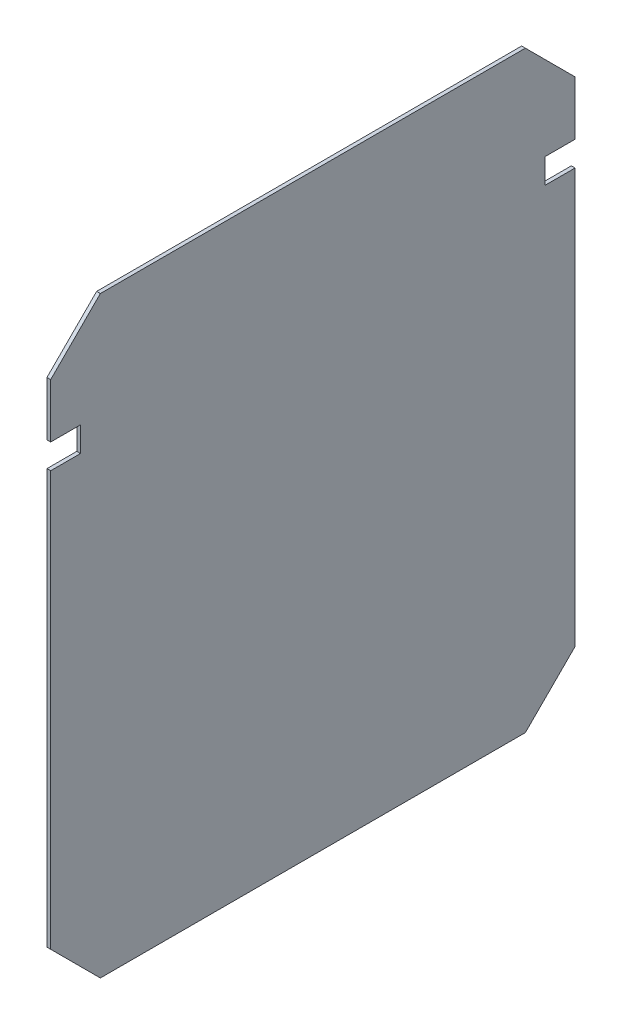
ISO-10303-21;
HEADER;
FILE_DESCRIPTION(('STEP AP214'),'2;1');
FILE_NAME('part.step','',(''),(''),'','','');
FILE_SCHEMA(('AUTOMOTIVE_DESIGN { 1 0 10303 214 1 1 1 1 }'));
ENDSEC;
DATA;
#1=APPLICATION_CONTEXT('core data for automotive mechanical design processes');
#2=APPLICATION_PROTOCOL_DEFINITION('international standard','automotive_design',2000,#1);
#3=PRODUCT_CONTEXT('',#1,'mechanical');
#4=PRODUCT('Part','Part','',(#3));
#5=PRODUCT_RELATED_PRODUCT_CATEGORY('part','',(#4));
#6=PRODUCT_DEFINITION_FORMATION('','',#4);
#7=PRODUCT_DEFINITION_CONTEXT('part definition',#1,'design');
#8=PRODUCT_DEFINITION('design','',#6,#7);
#9=PRODUCT_DEFINITION_SHAPE('','',#8);
#10=(LENGTH_UNIT() NAMED_UNIT(*) SI_UNIT(.MILLI.,.METRE.));
#11=(NAMED_UNIT(*) PLANE_ANGLE_UNIT() SI_UNIT($,.RADIAN.));
#12=(NAMED_UNIT(*) SI_UNIT($,.STERADIAN.) SOLID_ANGLE_UNIT());
#13=UNCERTAINTY_MEASURE_WITH_UNIT(LENGTH_MEASURE(1.E-05),#10,'distance_accuracy_value','');
#14=(GEOMETRIC_REPRESENTATION_CONTEXT(3) GLOBAL_UNCERTAINTY_ASSIGNED_CONTEXT((#13)) GLOBAL_UNIT_ASSIGNED_CONTEXT((#10,
#11,#12)) REPRESENTATION_CONTEXT('',''));
#15=CARTESIAN_POINT('',(0.,0.,0.));
#16=DIRECTION('',(0.,0.,1.));
#17=DIRECTION('',(1.,0.,0.));
#18=AXIS2_PLACEMENT_3D('',#15,#16,#17);
#19=CARTESIAN_POINT('',(1.5,-238.5,211.));
#20=DIRECTION('',(0.,0.,-1.));
#21=DIRECTION('',(0.,1.,0.));
#22=AXIS2_PLACEMENT_3D('',#19,#20,#21);
#23=PLANE('',#22);
#24=DIRECTION('',(-1.,0.,0.));
#25=VECTOR('',#24,1.);
#26=CARTESIAN_POINT('',(1.5,135.,211.));
#27=LINE('',#26,#25);
#28=CARTESIAN_POINT('',(1.5,135.,211.));
#29=VERTEX_POINT('',#28);
#30=CARTESIAN_POINT('',(-1.5,135.,211.));
#31=VERTEX_POINT('',#30);
#32=EDGE_CURVE('E135',#29,#31,#27,.T.);
#33=ORIENTED_EDGE('',*,*,#32,.T.);
#34=DIRECTION('',(0.,-1.,0.));
#35=VECTOR('',#34,1.);
#36=CARTESIAN_POINT('',(-1.5,-238.5,211.));
#37=LINE('',#36,#35);
#38=CARTESIAN_POINT('',(-1.5,-198.5,211.));
#39=VERTEX_POINT('',#38);
#40=EDGE_CURVE('E149',#31,#39,#37,.T.);
#41=ORIENTED_EDGE('',*,*,#40,.T.);
#42=DIRECTION('',(1.,0.,0.));
#43=VECTOR('',#42,1.);
#44=CARTESIAN_POINT('',(1.5,-198.5,211.));
#45=LINE('',#44,#43);
#46=CARTESIAN_POINT('',(1.5,-198.5,211.));
#47=VERTEX_POINT('',#46);
#48=EDGE_CURVE('E204',#39,#47,#45,.T.);
#49=ORIENTED_EDGE('',*,*,#48,.T.);
#50=DIRECTION('',(0.,-1.,0.));
#51=VECTOR('',#50,1.);
#52=CARTESIAN_POINT('',(1.5,-238.5,211.));
#53=LINE('',#52,#51);
#54=EDGE_CURVE('E151',#29,#47,#53,.T.);
#55=ORIENTED_EDGE('',*,*,#54,.F.);
#56=EDGE_LOOP('',(#33,#41,#49,#55));
#57=FACE_BOUND('',#56,.T.);
#58=ADVANCED_FACE('F17',(#57),#23,.F.);
#59=DIRECTION('',(-1.,0.,0.));
#60=VECTOR('',#59,1.);
#61=CARTESIAN_POINT('',(1.5,155.,211.));
#62=LINE('',#61,#60);
#63=CARTESIAN_POINT('',(1.5,155.,211.));
#64=VERTEX_POINT('',#63);
#65=CARTESIAN_POINT('',(-1.5,155.,211.));
#66=VERTEX_POINT('',#65);
#67=EDGE_CURVE('E33',#64,#66,#62,.T.);
#68=ORIENTED_EDGE('',*,*,#67,.F.);
#69=CARTESIAN_POINT('',(1.5,198.5,211.));
#70=VERTEX_POINT('',#69);
#71=EDGE_CURVE('E225',#70,#64,#53,.T.);
#72=ORIENTED_EDGE('',*,*,#71,.F.);
#73=DIRECTION('',(-1.,0.,0.));
#74=VECTOR('',#73,1.);
#75=CARTESIAN_POINT('',(1.5,198.5,211.));
#76=LINE('',#75,#74);
#77=CARTESIAN_POINT('',(-1.5,198.5,211.));
#78=VERTEX_POINT('',#77);
#79=EDGE_CURVE('E201',#70,#78,#76,.T.);
#80=ORIENTED_EDGE('',*,*,#79,.T.);
#81=EDGE_CURVE('E157',#78,#66,#37,.T.);
#82=ORIENTED_EDGE('',*,*,#81,.T.);
#83=EDGE_LOOP('',(#68,#72,#80,#82));
#84=FACE_BOUND('',#83,.T.);
#85=ADVANCED_FACE('F224',(#84),#23,.F.);
#86=CARTESIAN_POINT('',(1.5,-238.5,-211.));
#87=DIRECTION('',(0.,0.,1.));
#88=DIRECTION('',(1.,0.,0.));
#89=AXIS2_PLACEMENT_3D('',#86,#87,#88);
#90=PLANE('',#89);
#91=DIRECTION('',(-1.,0.,0.));
#92=VECTOR('',#91,1.);
#93=CARTESIAN_POINT('',(1.5,155.,-211.));
#94=LINE('',#93,#92);
#95=CARTESIAN_POINT('',(1.5,155.,-211.));
#96=VERTEX_POINT('',#95);
#97=CARTESIAN_POINT('',(-1.5,155.,-211.));
#98=VERTEX_POINT('',#97);
#99=EDGE_CURVE('E255',#96,#98,#94,.T.);
#100=ORIENTED_EDGE('',*,*,#99,.T.);
#101=DIRECTION('',(0.,1.,0.));
#102=VECTOR('',#101,1.);
#103=CARTESIAN_POINT('',(-1.5,-238.5,-211.));
#104=LINE('',#103,#102);
#105=CARTESIAN_POINT('',(-1.5,198.5,-211.));
#106=VERTEX_POINT('',#105);
#107=EDGE_CURVE('E167',#98,#106,#104,.T.);
#108=ORIENTED_EDGE('',*,*,#107,.T.);
#109=DIRECTION('',(1.,0.,0.));
#110=VECTOR('',#109,1.);
#111=CARTESIAN_POINT('',(1.5,198.5,-211.));
#112=LINE('',#111,#110);
#113=CARTESIAN_POINT('',(1.5,198.5,-211.));
#114=VERTEX_POINT('',#113);
#115=EDGE_CURVE('E174',#106,#114,#112,.T.);
#116=ORIENTED_EDGE('',*,*,#115,.T.);
#117=DIRECTION('',(0.,1.,0.));
#118=VECTOR('',#117,1.);
#119=CARTESIAN_POINT('',(1.5,-238.5,-211.));
#120=LINE('',#119,#118);
#121=EDGE_CURVE('E265',#96,#114,#120,.T.);
#122=ORIENTED_EDGE('',*,*,#121,.F.);
#123=EDGE_LOOP('',(#100,#108,#116,#122));
#124=FACE_BOUND('',#123,.T.);
#125=ADVANCED_FACE('F274',(#124),#90,.F.);
#126=DIRECTION('',(-1.,0.,0.));
#127=VECTOR('',#126,1.);
#128=CARTESIAN_POINT('',(1.5,135.,-211.));
#129=LINE('',#128,#127);
#130=CARTESIAN_POINT('',(1.5,135.,-211.));
#131=VERTEX_POINT('',#130);
#132=CARTESIAN_POINT('',(-1.5,135.,-211.));
#133=VERTEX_POINT('',#132);
#134=EDGE_CURVE('E41',#131,#133,#129,.T.);
#135=ORIENTED_EDGE('',*,*,#134,.F.);
#136=CARTESIAN_POINT('',(1.5,-198.5,-211.));
#137=VERTEX_POINT('',#136);
#138=EDGE_CURVE('E220',#137,#131,#120,.T.);
#139=ORIENTED_EDGE('',*,*,#138,.F.);
#140=DIRECTION('',(-1.,0.,0.));
#141=VECTOR('',#140,1.);
#142=CARTESIAN_POINT('',(1.5,-198.5,-211.));
#143=LINE('',#142,#141);
#144=CARTESIAN_POINT('',(-1.5,-198.5,-211.));
#145=VERTEX_POINT('',#144);
#146=EDGE_CURVE('E177',#137,#145,#143,.T.);
#147=ORIENTED_EDGE('',*,*,#146,.T.);
#148=EDGE_CURVE('E168',#145,#133,#104,.T.);
#149=ORIENTED_EDGE('',*,*,#148,.T.);
#150=EDGE_LOOP('',(#135,#139,#147,#149));
#151=FACE_BOUND('',#150,.T.);
#152=ADVANCED_FACE('F288',(#151),#90,.F.);
#153=CARTESIAN_POINT('',(1.5,0.,0.));
#154=DIRECTION('',(1.,0.,0.));
#155=DIRECTION('',(0.,0.,-1.));
#156=AXIS2_PLACEMENT_3D('',#153,#154,#155);
#157=PLANE('',#156);
#158=DIRECTION('',(0.,1.,0.));
#159=VECTOR('',#158,1.);
#160=CARTESIAN_POINT('',(1.5,155.,187.));
#161=LINE('',#160,#159);
#162=CARTESIAN_POINT('',(1.5,135.,187.));
#163=VERTEX_POINT('',#162);
#164=CARTESIAN_POINT('',(1.5,155.,187.));
#165=VERTEX_POINT('',#164);
#166=EDGE_CURVE('E230',#163,#165,#161,.T.);
#167=ORIENTED_EDGE('',*,*,#166,.F.);
#168=DIRECTION('',(0.,0.,-1.));
#169=VECTOR('',#168,1.);
#170=CARTESIAN_POINT('',(1.5,135.,211.));
#171=LINE('',#170,#169);
#172=EDGE_CURVE('E228',#29,#163,#171,.T.);
#173=ORIENTED_EDGE('',*,*,#172,.F.);
#174=ORIENTED_EDGE('',*,*,#54,.T.);
#175=DIRECTION('',(0.,0.707106781186548,0.707106781186547));
#176=VECTOR('',#175,1.);
#177=CARTESIAN_POINT('',(1.5,-204.75,204.75));
#178=LINE('',#177,#176);
#179=CARTESIAN_POINT('',(1.5,-238.5,171.));
#180=VERTEX_POINT('',#179);
#181=EDGE_CURVE('E197',#47,#180,#178,.F.);
#182=ORIENTED_EDGE('',*,*,#181,.T.);
#183=DIRECTION('',(0.,0.,-1.));
#184=VECTOR('',#183,1.);
#185=CARTESIAN_POINT('',(1.5,-238.5,-211.));
#186=LINE('',#185,#184);
#187=CARTESIAN_POINT('',(1.5,-238.5,-171.));
#188=VERTEX_POINT('',#187);
#189=EDGE_CURVE('E263',#180,#188,#186,.T.);
#190=ORIENTED_EDGE('',*,*,#189,.T.);
#191=DIRECTION('',(0.,-0.707106781186546,0.707106781186549));
#192=VECTOR('',#191,1.);
#193=CARTESIAN_POINT('',(1.5,-204.75,-204.75));
#194=LINE('',#193,#192);
#195=EDGE_CURVE('E199',#188,#137,#194,.F.);
#196=ORIENTED_EDGE('',*,*,#195,.T.);
#197=ORIENTED_EDGE('',*,*,#138,.T.);
#198=DIRECTION('',(0.,0.,-1.));
#199=VECTOR('',#198,1.);
#200=CARTESIAN_POINT('',(1.5,135.,-211.));
#201=LINE('',#200,#199);
#202=CARTESIAN_POINT('',(1.5,135.,-187.));
#203=VERTEX_POINT('',#202);
#204=EDGE_CURVE('E253',#203,#131,#201,.T.);
#205=ORIENTED_EDGE('',*,*,#204,.F.);
#206=DIRECTION('',(0.,-1.,0.));
#207=VECTOR('',#206,1.);
#208=CARTESIAN_POINT('',(1.5,155.,-187.));
#209=LINE('',#208,#207);
#210=CARTESIAN_POINT('',(1.5,155.,-187.));
#211=VERTEX_POINT('',#210);
#212=EDGE_CURVE('E251',#211,#203,#209,.T.);
#213=ORIENTED_EDGE('',*,*,#212,.F.);
#214=DIRECTION('',(0.,0.,1.));
#215=VECTOR('',#214,1.);
#216=CARTESIAN_POINT('',(1.5,155.,-211.));
#217=LINE('',#216,#215);
#218=EDGE_CURVE('E249',#96,#211,#217,.T.);
#219=ORIENTED_EDGE('',*,*,#218,.F.);
#220=ORIENTED_EDGE('',*,*,#121,.T.);
#221=DIRECTION('',(0.,-0.707106781186549,-0.707106781186546));
#222=VECTOR('',#221,1.);
#223=CARTESIAN_POINT('',(1.5,204.75,-204.75));
#224=LINE('',#223,#222);
#225=CARTESIAN_POINT('',(1.5,238.5,-171.));
#226=VERTEX_POINT('',#225);
#227=EDGE_CURVE('E195',#114,#226,#224,.F.);
#228=ORIENTED_EDGE('',*,*,#227,.T.);
#229=DIRECTION('',(0.,0.,1.));
#230=VECTOR('',#229,1.);
#231=CARTESIAN_POINT('',(1.5,238.5,-211.));
#232=LINE('',#231,#230);
#233=CARTESIAN_POINT('',(1.5,238.5,171.));
#234=VERTEX_POINT('',#233);
#235=EDGE_CURVE('E163',#226,#234,#232,.T.);
#236=ORIENTED_EDGE('',*,*,#235,.T.);
#237=DIRECTION('',(0.,0.707106781186546,-0.70710678118655));
#238=VECTOR('',#237,1.);
#239=CARTESIAN_POINT('',(1.5,204.75,204.75));
#240=LINE('',#239,#238);
#241=EDGE_CURVE('E193',#234,#70,#240,.F.);
#242=ORIENTED_EDGE('',*,*,#241,.T.);
#243=ORIENTED_EDGE('',*,*,#71,.T.);
#244=DIRECTION('',(0.,0.,1.));
#245=VECTOR('',#244,1.);
#246=CARTESIAN_POINT('',(1.5,155.,211.));
#247=LINE('',#246,#245);
#248=EDGE_CURVE('E235',#165,#64,#247,.T.);
#249=ORIENTED_EDGE('',*,*,#248,.F.);
#250=EDGE_LOOP('',(#167,#173,#174,#182,#190,#196,#197,#205,#213,#219,#220,#228,#236,#242,#243,#249));
#251=FACE_BOUND('',#250,.T.);
#252=ADVANCED_FACE('F216',(#251),#157,.T.);
#253=CARTESIAN_POINT('',(-1.5,0.,0.));
#254=DIRECTION('',(1.,0.,0.));
#255=DIRECTION('',(0.,0.,-1.));
#256=AXIS2_PLACEMENT_3D('',#253,#254,#255);
#257=PLANE('',#256);
#258=DIRECTION('',(0.,0.,-1.));
#259=VECTOR('',#258,1.);
#260=CARTESIAN_POINT('',(-1.5,135.,211.));
#261=LINE('',#260,#259);
#262=CARTESIAN_POINT('',(-1.5,135.,187.));
#263=VERTEX_POINT('',#262);
#264=EDGE_CURVE('E132',#31,#263,#261,.T.);
#265=ORIENTED_EDGE('',*,*,#264,.T.);
#266=DIRECTION('',(0.,1.,0.));
#267=VECTOR('',#266,1.);
#268=CARTESIAN_POINT('',(-1.5,155.,187.));
#269=LINE('',#268,#267);
#270=CARTESIAN_POINT('',(-1.5,155.,187.));
#271=VERTEX_POINT('',#270);
#272=EDGE_CURVE('E143',#263,#271,#269,.T.);
#273=ORIENTED_EDGE('',*,*,#272,.T.);
#274=DIRECTION('',(0.,0.,1.));
#275=VECTOR('',#274,1.);
#276=CARTESIAN_POINT('',(-1.5,155.,211.));
#277=LINE('',#276,#275);
#278=EDGE_CURVE('E226',#271,#66,#277,.T.);
#279=ORIENTED_EDGE('',*,*,#278,.T.);
#280=ORIENTED_EDGE('',*,*,#81,.F.);
#281=DIRECTION('',(0.,-0.707106781186546,0.70710678118655));
#282=VECTOR('',#281,1.);
#283=CARTESIAN_POINT('',(-1.5,198.5,211.));
#284=LINE('',#283,#282);
#285=CARTESIAN_POINT('',(-1.5,238.5,171.));
#286=VERTEX_POINT('',#285);
#287=EDGE_CURVE('E180',#78,#286,#284,.F.);
#288=ORIENTED_EDGE('',*,*,#287,.T.);
#289=DIRECTION('',(0.,0.,1.));
#290=VECTOR('',#289,1.);
#291=CARTESIAN_POINT('',(-1.5,238.5,-211.));
#292=LINE('',#291,#290);
#293=CARTESIAN_POINT('',(-1.5,238.5,-171.));
#294=VERTEX_POINT('',#293);
#295=EDGE_CURVE('E171',#294,#286,#292,.T.);
#296=ORIENTED_EDGE('',*,*,#295,.F.);
#297=DIRECTION('',(0.,0.707106781186549,0.707106781186546));
#298=VECTOR('',#297,1.);
#299=CARTESIAN_POINT('',(-1.5,238.5,-171.));
#300=LINE('',#299,#298);
#301=EDGE_CURVE('E182',#294,#106,#300,.F.);
#302=ORIENTED_EDGE('',*,*,#301,.T.);
#303=ORIENTED_EDGE('',*,*,#107,.F.);
#304=DIRECTION('',(0.,0.,1.));
#305=VECTOR('',#304,1.);
#306=CARTESIAN_POINT('',(-1.5,155.,-211.));
#307=LINE('',#306,#305);
#308=CARTESIAN_POINT('',(-1.5,155.,-187.));
#309=VERTEX_POINT('',#308);
#310=EDGE_CURVE('E241',#98,#309,#307,.T.);
#311=ORIENTED_EDGE('',*,*,#310,.T.);
#312=DIRECTION('',(0.,-1.,0.));
#313=VECTOR('',#312,1.);
#314=CARTESIAN_POINT('',(-1.5,155.,-187.));
#315=LINE('',#314,#313);
#316=CARTESIAN_POINT('',(-1.5,135.,-187.));
#317=VERTEX_POINT('',#316);
#318=EDGE_CURVE('E244',#309,#317,#315,.T.);
#319=ORIENTED_EDGE('',*,*,#318,.T.);
#320=DIRECTION('',(0.,0.,-1.));
#321=VECTOR('',#320,1.);
#322=CARTESIAN_POINT('',(-1.5,135.,-211.));
#323=LINE('',#322,#321);
#324=EDGE_CURVE('E247',#317,#133,#323,.T.);
#325=ORIENTED_EDGE('',*,*,#324,.T.);
#326=ORIENTED_EDGE('',*,*,#148,.F.);
#327=DIRECTION('',(0.,0.707106781186546,-0.707106781186549));
#328=VECTOR('',#327,1.);
#329=CARTESIAN_POINT('',(-1.5,-198.5,-211.));
#330=LINE('',#329,#328);
#331=CARTESIAN_POINT('',(-1.5,-238.5,-171.));
#332=VERTEX_POINT('',#331);
#333=EDGE_CURVE('E186',#145,#332,#330,.F.);
#334=ORIENTED_EDGE('',*,*,#333,.T.);
#335=DIRECTION('',(0.,0.,-1.));
#336=VECTOR('',#335,1.);
#337=CARTESIAN_POINT('',(-1.5,-238.5,-211.));
#338=LINE('',#337,#336);
#339=CARTESIAN_POINT('',(-1.5,-238.5,171.));
#340=VERTEX_POINT('',#339);
#341=EDGE_CURVE('E160',#340,#332,#338,.T.);
#342=ORIENTED_EDGE('',*,*,#341,.F.);
#343=DIRECTION('',(0.,-0.707106781186548,-0.707106781186547));
#344=VECTOR('',#343,1.);
#345=CARTESIAN_POINT('',(-1.5,-238.5,171.));
#346=LINE('',#345,#344);
#347=EDGE_CURVE('E155',#340,#39,#346,.F.);
#348=ORIENTED_EDGE('',*,*,#347,.T.);
#349=ORIENTED_EDGE('',*,*,#40,.F.);
#350=EDGE_LOOP('',(#265,#273,#279,#280,#288,#296,#302,#303,#311,#319,#325,#326,#334,#342,#348,#349));
#351=FACE_BOUND('',#350,.T.);
#352=ADVANCED_FACE('F153',(#351),#257,.F.);
#353=CARTESIAN_POINT('',(1.5,-238.5,-211.));
#354=DIRECTION('',(0.,1.,0.));
#355=DIRECTION('',(0.,0.,1.));
#356=AXIS2_PLACEMENT_3D('',#353,#354,#355);
#357=PLANE('',#356);
#358=ORIENTED_EDGE('',*,*,#341,.T.);
#359=DIRECTION('',(1.,0.,0.));
#360=VECTOR('',#359,1.);
#361=CARTESIAN_POINT('',(1.5,-238.5,-171.));
#362=LINE('',#361,#360);
#363=EDGE_CURVE('E191',#332,#188,#362,.T.);
#364=ORIENTED_EDGE('',*,*,#363,.T.);
#365=ORIENTED_EDGE('',*,*,#189,.F.);
#366=DIRECTION('',(-1.,0.,0.));
#367=VECTOR('',#366,1.);
#368=CARTESIAN_POINT('',(1.5,-238.5,171.));
#369=LINE('',#368,#367);
#370=EDGE_CURVE('E188',#180,#340,#369,.T.);
#371=ORIENTED_EDGE('',*,*,#370,.T.);
#372=EDGE_LOOP('',(#358,#364,#365,#371));
#373=FACE_BOUND('',#372,.T.);
#374=ADVANCED_FACE('F295',(#373),#357,.F.);
#375=CARTESIAN_POINT('',(1.5,238.5,-211.));
#376=DIRECTION('',(0.,-1.,0.));
#377=DIRECTION('',(0.,0.,-1.));
#378=AXIS2_PLACEMENT_3D('',#375,#376,#377);
#379=PLANE('',#378);
#380=ORIENTED_EDGE('',*,*,#235,.F.);
#381=DIRECTION('',(-1.,0.,0.));
#382=VECTOR('',#381,1.);
#383=CARTESIAN_POINT('',(1.5,238.5,-171.));
#384=LINE('',#383,#382);
#385=EDGE_CURVE('E11',#226,#294,#384,.T.);
#386=ORIENTED_EDGE('',*,*,#385,.T.);
#387=ORIENTED_EDGE('',*,*,#295,.T.);
#388=DIRECTION('',(1.,0.,0.));
#389=VECTOR('',#388,1.);
#390=CARTESIAN_POINT('',(1.5,238.5,171.));
#391=LINE('',#390,#389);
#392=EDGE_CURVE('E26',#286,#234,#391,.T.);
#393=ORIENTED_EDGE('',*,*,#392,.T.);
#394=EDGE_LOOP('',(#380,#386,#387,#393));
#395=FACE_BOUND('',#394,.T.);
#396=ADVANCED_FACE('F209',(#395),#379,.F.);
#397=CARTESIAN_POINT('',(1.5,-198.5,-211.));
#398=DIRECTION('',(0.,0.707106781186549,0.707106781186546));
#399=DIRECTION('',(-1.,0.,0.));
#400=AXIS2_PLACEMENT_3D('',#397,#398,#399);
#401=PLANE('',#400);
#402=ORIENTED_EDGE('',*,*,#195,.F.);
#403=ORIENTED_EDGE('',*,*,#363,.F.);
#404=ORIENTED_EDGE('',*,*,#333,.F.);
#405=ORIENTED_EDGE('',*,*,#146,.F.);
#406=EDGE_LOOP('',(#402,#403,#404,#405));
#407=FACE_BOUND('',#406,.T.);
#408=ADVANCED_FACE('F292',(#407),#401,.F.);
#409=CARTESIAN_POINT('',(1.5,-238.5,171.));
#410=DIRECTION('',(0.,0.707106781186547,-0.707106781186548));
#411=DIRECTION('',(-1.,0.,0.));
#412=AXIS2_PLACEMENT_3D('',#409,#410,#411);
#413=PLANE('',#412);
#414=ORIENTED_EDGE('',*,*,#181,.F.);
#415=ORIENTED_EDGE('',*,*,#48,.F.);
#416=ORIENTED_EDGE('',*,*,#347,.F.);
#417=ORIENTED_EDGE('',*,*,#370,.F.);
#418=EDGE_LOOP('',(#414,#415,#416,#417));
#419=FACE_BOUND('',#418,.T.);
#420=ADVANCED_FACE('F300',(#419),#413,.F.);
#421=CARTESIAN_POINT('',(1.5,238.5,-171.));
#422=DIRECTION('',(0.,-0.707106781186546,0.707106781186549));
#423=DIRECTION('',(-1.,0.,0.));
#424=AXIS2_PLACEMENT_3D('',#421,#422,#423);
#425=PLANE('',#424);
#426=ORIENTED_EDGE('',*,*,#227,.F.);
#427=ORIENTED_EDGE('',*,*,#115,.F.);
#428=ORIENTED_EDGE('',*,*,#301,.F.);
#429=ORIENTED_EDGE('',*,*,#385,.F.);
#430=EDGE_LOOP('',(#426,#427,#428,#429));
#431=FACE_BOUND('',#430,.T.);
#432=ADVANCED_FACE('F277',(#431),#425,.F.);
#433=CARTESIAN_POINT('',(1.5,198.5,211.));
#434=DIRECTION('',(0.,-0.707106781186549,-0.707106781186546));
#435=DIRECTION('',(-1.,0.,0.));
#436=AXIS2_PLACEMENT_3D('',#433,#434,#435);
#437=PLANE('',#436);
#438=ORIENTED_EDGE('',*,*,#241,.F.);
#439=ORIENTED_EDGE('',*,*,#392,.F.);
#440=ORIENTED_EDGE('',*,*,#287,.F.);
#441=ORIENTED_EDGE('',*,*,#79,.F.);
#442=EDGE_LOOP('',(#438,#439,#440,#441));
#443=FACE_BOUND('',#442,.T.);
#444=ADVANCED_FACE('F20',(#443),#437,.F.);
#445=CARTESIAN_POINT('',(1.5,155.,-211.));
#446=DIRECTION('',(0.,-1.,0.));
#447=DIRECTION('',(0.,0.,-1.));
#448=AXIS2_PLACEMENT_3D('',#445,#446,#447);
#449=PLANE('',#448);
#450=ORIENTED_EDGE('',*,*,#99,.F.);
#451=ORIENTED_EDGE('',*,*,#218,.T.);
#452=DIRECTION('',(-1.,0.,0.));
#453=VECTOR('',#452,1.);
#454=CARTESIAN_POINT('',(1.5,155.,-187.));
#455=LINE('',#454,#453);
#456=EDGE_CURVE('E144',#211,#309,#455,.T.);
#457=ORIENTED_EDGE('',*,*,#456,.T.);
#458=ORIENTED_EDGE('',*,*,#310,.F.);
#459=EDGE_LOOP('',(#450,#451,#457,#458));
#460=FACE_BOUND('',#459,.T.);
#461=ADVANCED_FACE('F280',(#460),#449,.T.);
#462=CARTESIAN_POINT('',(1.5,155.,-187.));
#463=DIRECTION('',(0.,0.,-1.));
#464=DIRECTION('',(-1.,0.,0.));
#465=AXIS2_PLACEMENT_3D('',#462,#463,#464);
#466=PLANE('',#465);
#467=ORIENTED_EDGE('',*,*,#456,.F.);
#468=ORIENTED_EDGE('',*,*,#212,.T.);
#469=DIRECTION('',(-1.,0.,0.));
#470=VECTOR('',#469,1.);
#471=CARTESIAN_POINT('',(1.5,135.,-187.));
#472=LINE('',#471,#470);
#473=EDGE_CURVE('E259',#203,#317,#472,.T.);
#474=ORIENTED_EDGE('',*,*,#473,.T.);
#475=ORIENTED_EDGE('',*,*,#318,.F.);
#476=EDGE_LOOP('',(#467,#468,#474,#475));
#477=FACE_BOUND('',#476,.T.);
#478=ADVANCED_FACE('F283',(#477),#466,.T.);
#479=CARTESIAN_POINT('',(1.5,135.,-211.));
#480=DIRECTION('',(0.,1.,0.));
#481=DIRECTION('',(0.,0.,1.));
#482=AXIS2_PLACEMENT_3D('',#479,#480,#481);
#483=PLANE('',#482);
#484=ORIENTED_EDGE('',*,*,#473,.F.);
#485=ORIENTED_EDGE('',*,*,#204,.T.);
#486=ORIENTED_EDGE('',*,*,#134,.T.);
#487=ORIENTED_EDGE('',*,*,#324,.F.);
#488=EDGE_LOOP('',(#484,#485,#486,#487));
#489=FACE_BOUND('',#488,.T.);
#490=ADVANCED_FACE('F285',(#489),#483,.T.);
#491=CARTESIAN_POINT('',(1.5,135.,211.));
#492=DIRECTION('',(0.,1.,0.));
#493=DIRECTION('',(0.,0.,1.));
#494=AXIS2_PLACEMENT_3D('',#491,#492,#493);
#495=PLANE('',#494);
#496=ORIENTED_EDGE('',*,*,#32,.F.);
#497=ORIENTED_EDGE('',*,*,#172,.T.);
#498=DIRECTION('',(-1.,0.,0.));
#499=VECTOR('',#498,1.);
#500=CARTESIAN_POINT('',(1.5,135.,187.));
#501=LINE('',#500,#499);
#502=EDGE_CURVE('E138',#163,#263,#501,.T.);
#503=ORIENTED_EDGE('',*,*,#502,.T.);
#504=ORIENTED_EDGE('',*,*,#264,.F.);
#505=EDGE_LOOP('',(#496,#497,#503,#504));
#506=FACE_BOUND('',#505,.T.);
#507=ADVANCED_FACE('F134',(#506),#495,.T.);
#508=CARTESIAN_POINT('',(1.5,155.,187.));
#509=DIRECTION('',(0.,0.,1.));
#510=DIRECTION('',(1.,0.,0.));
#511=AXIS2_PLACEMENT_3D('',#508,#509,#510);
#512=PLANE('',#511);
#513=ORIENTED_EDGE('',*,*,#502,.F.);
#514=ORIENTED_EDGE('',*,*,#166,.T.);
#515=DIRECTION('',(-1.,0.,0.));
#516=VECTOR('',#515,1.);
#517=CARTESIAN_POINT('',(1.5,155.,187.));
#518=LINE('',#517,#516);
#519=EDGE_CURVE('E238',#165,#271,#518,.T.);
#520=ORIENTED_EDGE('',*,*,#519,.T.);
#521=ORIENTED_EDGE('',*,*,#272,.F.);
#522=EDGE_LOOP('',(#513,#514,#520,#521));
#523=FACE_BOUND('',#522,.T.);
#524=ADVANCED_FACE('F303',(#523),#512,.T.);
#525=CARTESIAN_POINT('',(1.5,155.,211.));
#526=DIRECTION('',(0.,-1.,0.));
#527=DIRECTION('',(0.,0.,-1.));
#528=AXIS2_PLACEMENT_3D('',#525,#526,#527);
#529=PLANE('',#528);
#530=ORIENTED_EDGE('',*,*,#519,.F.);
#531=ORIENTED_EDGE('',*,*,#248,.T.);
#532=ORIENTED_EDGE('',*,*,#67,.T.);
#533=ORIENTED_EDGE('',*,*,#278,.F.);
#534=EDGE_LOOP('',(#530,#531,#532,#533));
#535=FACE_BOUND('',#534,.T.);
#536=ADVANCED_FACE('F304',(#535),#529,.T.);
#537=CLOSED_SHELL('',(#58,#85,#125,#152,#252,#352,#374,#396,#408,#420,#432,#444,#461,#478,#490,
#507,#524,#536));
#538=MANIFOLD_SOLID_BREP('B1',#537);
#539=ADVANCED_BREP_SHAPE_REPRESENTATION('',(#18,#538),#14);
#540=SHAPE_DEFINITION_REPRESENTATION(#9,#539);
ENDSEC;
END-ISO-10303-21;
